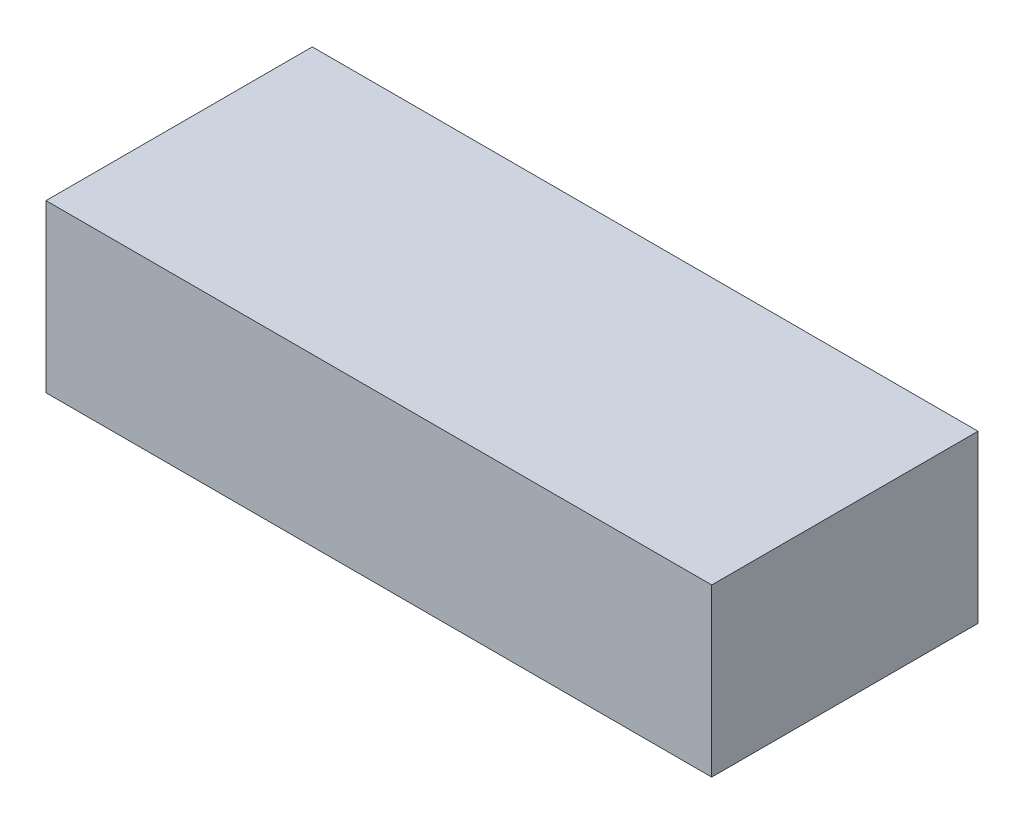
ISO-10303-21;
HEADER;
FILE_DESCRIPTION(('STEP AP214'),'2;1');
FILE_NAME('part.step','',(''),(''),'','','');
FILE_SCHEMA(('AUTOMOTIVE_DESIGN { 1 0 10303 214 1 1 1 1 }'));
ENDSEC;
DATA;
#1=APPLICATION_CONTEXT('core data for automotive mechanical design processes');
#2=APPLICATION_PROTOCOL_DEFINITION('international standard','automotive_design',2000,#1);
#3=PRODUCT_CONTEXT('',#1,'mechanical');
#4=PRODUCT('Part','Part','',(#3));
#5=PRODUCT_RELATED_PRODUCT_CATEGORY('part','',(#4));
#6=PRODUCT_DEFINITION_FORMATION('','',#4);
#7=PRODUCT_DEFINITION_CONTEXT('part definition',#1,'design');
#8=PRODUCT_DEFINITION('design','',#6,#7);
#9=PRODUCT_DEFINITION_SHAPE('','',#8);
#10=(LENGTH_UNIT() NAMED_UNIT(*) SI_UNIT(.MILLI.,.METRE.));
#11=(NAMED_UNIT(*) PLANE_ANGLE_UNIT() SI_UNIT($,.RADIAN.));
#12=(NAMED_UNIT(*) SI_UNIT($,.STERADIAN.) SOLID_ANGLE_UNIT());
#13=UNCERTAINTY_MEASURE_WITH_UNIT(LENGTH_MEASURE(1.E-05),#10,'distance_accuracy_value','');
#14=(GEOMETRIC_REPRESENTATION_CONTEXT(3) GLOBAL_UNCERTAINTY_ASSIGNED_CONTEXT((#13)) GLOBAL_UNIT_ASSIGNED_CONTEXT((#10,
#11,#12)) REPRESENTATION_CONTEXT('',''));
#15=CARTESIAN_POINT('',(0.,0.,0.));
#16=DIRECTION('',(0.,0.,1.));
#17=DIRECTION('',(1.,0.,0.));
#18=AXIS2_PLACEMENT_3D('',#15,#16,#17);
#19=CARTESIAN_POINT('',(-20.,10.,-8.));
#20=DIRECTION('',(1.,0.,0.));
#21=DIRECTION('',(0.,0.,-1.));
#22=AXIS2_PLACEMENT_3D('',#19,#20,#21);
#23=PLANE('',#22);
#24=DIRECTION('',(0.,0.,1.));
#25=VECTOR('',#24,1.);
#26=CARTESIAN_POINT('',(-20.,0.,-8.));
#27=LINE('',#26,#25);
#28=CARTESIAN_POINT('',(-20.,0.,-8.));
#29=VERTEX_POINT('',#28);
#30=CARTESIAN_POINT('',(-20.,0.,8.));
#31=VERTEX_POINT('',#30);
#32=EDGE_CURVE('E107',#29,#31,#27,.T.);
#33=ORIENTED_EDGE('',*,*,#32,.T.);
#34=DIRECTION('',(0.,-1.,0.));
#35=VECTOR('',#34,1.);
#36=CARTESIAN_POINT('',(-20.,10.,8.));
#37=LINE('',#36,#35);
#38=CARTESIAN_POINT('',(-20.,10.,8.));
#39=VERTEX_POINT('',#38);
#40=EDGE_CURVE('E11',#39,#31,#37,.T.);
#41=ORIENTED_EDGE('',*,*,#40,.F.);
#42=DIRECTION('',(0.,0.,1.));
#43=VECTOR('',#42,1.);
#44=CARTESIAN_POINT('',(-20.,10.,-8.));
#45=LINE('',#44,#43);
#46=CARTESIAN_POINT('',(-20.,10.,-8.));
#47=VERTEX_POINT('',#46);
#48=EDGE_CURVE('E92',#47,#39,#45,.T.);
#49=ORIENTED_EDGE('',*,*,#48,.F.);
#50=DIRECTION('',(0.,-1.,0.));
#51=VECTOR('',#50,1.);
#52=CARTESIAN_POINT('',(-20.,10.,-8.));
#53=LINE('',#52,#51);
#54=EDGE_CURVE('E105',#47,#29,#53,.T.);
#55=ORIENTED_EDGE('',*,*,#54,.T.);
#56=EDGE_LOOP('',(#33,#41,#49,#55));
#57=FACE_BOUND('',#56,.T.);
#58=ADVANCED_FACE('F43',(#57),#23,.F.);
#59=CARTESIAN_POINT('',(-20.,10.,8.));
#60=DIRECTION('',(0.,0.,-1.));
#61=DIRECTION('',(-1.,0.,0.));
#62=AXIS2_PLACEMENT_3D('',#59,#60,#61);
#63=PLANE('',#62);
#64=DIRECTION('',(1.,0.,0.));
#65=VECTOR('',#64,1.);
#66=CARTESIAN_POINT('',(-20.,0.,8.));
#67=LINE('',#66,#65);
#68=CARTESIAN_POINT('',(20.,0.,8.));
#69=VERTEX_POINT('',#68);
#70=EDGE_CURVE('E97',#31,#69,#67,.T.);
#71=ORIENTED_EDGE('',*,*,#70,.T.);
#72=DIRECTION('',(0.,-1.,0.));
#73=VECTOR('',#72,1.);
#74=CARTESIAN_POINT('',(20.,10.,8.));
#75=LINE('',#74,#73);
#76=CARTESIAN_POINT('',(20.,10.,8.));
#77=VERTEX_POINT('',#76);
#78=EDGE_CURVE('E51',#77,#69,#75,.T.);
#79=ORIENTED_EDGE('',*,*,#78,.F.);
#80=DIRECTION('',(1.,0.,0.));
#81=VECTOR('',#80,1.);
#82=CARTESIAN_POINT('',(-20.,10.,8.));
#83=LINE('',#82,#81);
#84=EDGE_CURVE('E87',#39,#77,#83,.T.);
#85=ORIENTED_EDGE('',*,*,#84,.F.);
#86=ORIENTED_EDGE('',*,*,#40,.T.);
#87=EDGE_LOOP('',(#71,#79,#85,#86));
#88=FACE_BOUND('',#87,.T.);
#89=ADVANCED_FACE('F100',(#88),#63,.F.);
#90=CARTESIAN_POINT('',(20.,10.,8.));
#91=DIRECTION('',(-1.,0.,0.));
#92=DIRECTION('',(0.,0.,1.));
#93=AXIS2_PLACEMENT_3D('',#90,#91,#92);
#94=PLANE('',#93);
#95=DIRECTION('',(0.,0.,-1.));
#96=VECTOR('',#95,1.);
#97=CARTESIAN_POINT('',(20.,0.,8.));
#98=LINE('',#97,#96);
#99=CARTESIAN_POINT('',(20.,0.,-8.));
#100=VERTEX_POINT('',#99);
#101=EDGE_CURVE('E78',#69,#100,#98,.T.);
#102=ORIENTED_EDGE('',*,*,#101,.T.);
#103=DIRECTION('',(0.,-1.,0.));
#104=VECTOR('',#103,1.);
#105=CARTESIAN_POINT('',(20.,10.,-8.));
#106=LINE('',#105,#104);
#107=CARTESIAN_POINT('',(20.,10.,-8.));
#108=VERTEX_POINT('',#107);
#109=EDGE_CURVE('E98',#108,#100,#106,.T.);
#110=ORIENTED_EDGE('',*,*,#109,.F.);
#111=DIRECTION('',(0.,0.,-1.));
#112=VECTOR('',#111,1.);
#113=CARTESIAN_POINT('',(20.,10.,8.));
#114=LINE('',#113,#112);
#115=EDGE_CURVE('E95',#77,#108,#114,.T.);
#116=ORIENTED_EDGE('',*,*,#115,.F.);
#117=ORIENTED_EDGE('',*,*,#78,.T.);
#118=EDGE_LOOP('',(#102,#110,#116,#117));
#119=FACE_BOUND('',#118,.T.);
#120=ADVANCED_FACE('F99',(#119),#94,.F.);
#121=CARTESIAN_POINT('',(20.,10.,-8.));
#122=DIRECTION('',(0.,0.,1.));
#123=DIRECTION('',(1.,0.,0.));
#124=AXIS2_PLACEMENT_3D('',#121,#122,#123);
#125=PLANE('',#124);
#126=DIRECTION('',(-1.,0.,0.));
#127=VECTOR('',#126,1.);
#128=CARTESIAN_POINT('',(20.,0.,-8.));
#129=LINE('',#128,#127);
#130=EDGE_CURVE('E85',#100,#29,#129,.T.);
#131=ORIENTED_EDGE('',*,*,#130,.T.);
#132=ORIENTED_EDGE('',*,*,#54,.F.);
#133=DIRECTION('',(-1.,0.,0.));
#134=VECTOR('',#133,1.);
#135=CARTESIAN_POINT('',(20.,10.,-8.));
#136=LINE('',#135,#134);
#137=EDGE_CURVE('E56',#108,#47,#136,.T.);
#138=ORIENTED_EDGE('',*,*,#137,.F.);
#139=ORIENTED_EDGE('',*,*,#109,.T.);
#140=EDGE_LOOP('',(#131,#132,#138,#139));
#141=FACE_BOUND('',#140,.T.);
#142=ADVANCED_FACE('F111',(#141),#125,.F.);
#143=CARTESIAN_POINT('',(0.,10.,0.));
#144=DIRECTION('',(0.,1.,0.));
#145=DIRECTION('',(0.,0.,1.));
#146=AXIS2_PLACEMENT_3D('',#143,#144,#145);
#147=PLANE('',#146);
#148=ORIENTED_EDGE('',*,*,#48,.T.);
#149=ORIENTED_EDGE('',*,*,#84,.T.);
#150=ORIENTED_EDGE('',*,*,#115,.T.);
#151=ORIENTED_EDGE('',*,*,#137,.T.);
#152=EDGE_LOOP('',(#148,#149,#150,#151));
#153=FACE_BOUND('',#152,.T.);
#154=ADVANCED_FACE('F89',(#153),#147,.T.);
#155=CARTESIAN_POINT('',(0.,0.,0.));
#156=DIRECTION('',(0.,1.,0.));
#157=DIRECTION('',(0.,0.,1.));
#158=AXIS2_PLACEMENT_3D('',#155,#156,#157);
#159=PLANE('',#158);
#160=ORIENTED_EDGE('',*,*,#32,.F.);
#161=ORIENTED_EDGE('',*,*,#130,.F.);
#162=ORIENTED_EDGE('',*,*,#101,.F.);
#163=ORIENTED_EDGE('',*,*,#70,.F.);
#164=EDGE_LOOP('',(#160,#161,#162,#163));
#165=FACE_BOUND('',#164,.T.);
#166=ADVANCED_FACE('F117',(#165),#159,.F.);
#167=CLOSED_SHELL('',(#58,#89,#120,#142,#154,#166));
#168=MANIFOLD_SOLID_BREP('B2',#167);
#169=ADVANCED_BREP_SHAPE_REPRESENTATION('',(#18,#168),#14);
#170=SHAPE_DEFINITION_REPRESENTATION(#9,#169);
ENDSEC;
END-ISO-10303-21;
